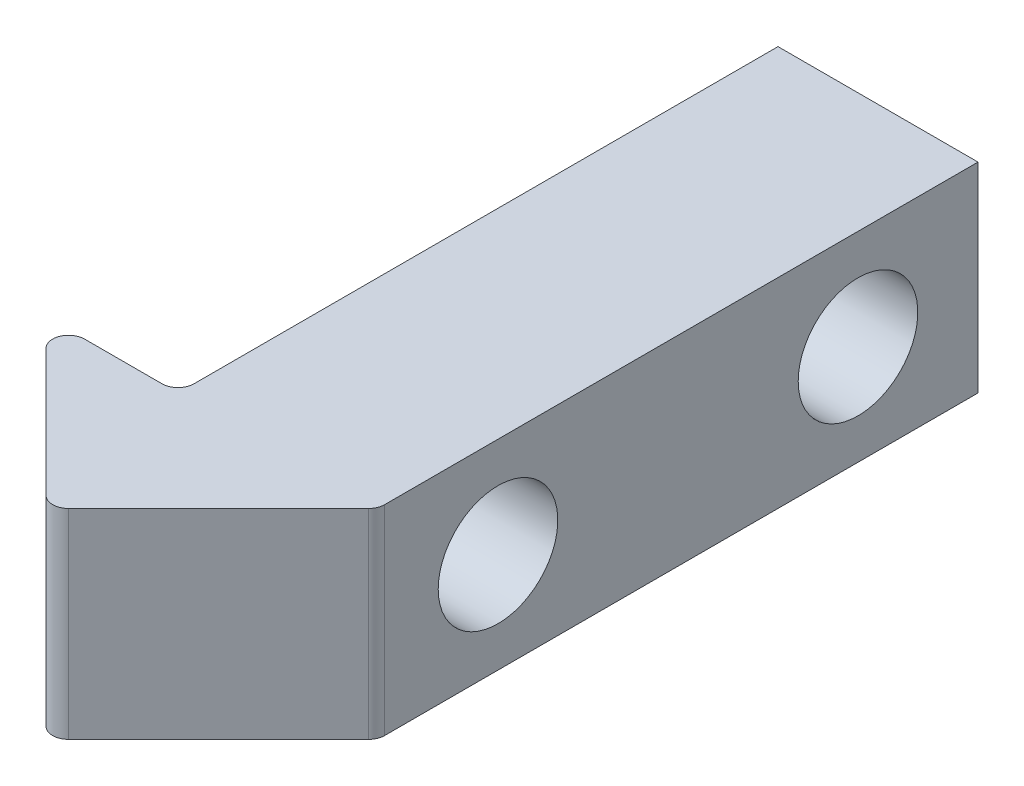
ISO-10303-21;
HEADER;
FILE_DESCRIPTION(('STEP AP214'),'2;1');
FILE_NAME('part.step','',(''),(''),'','','');
FILE_SCHEMA(('AUTOMOTIVE_DESIGN { 1 0 10303 214 1 1 1 1 }'));
ENDSEC;
DATA;
#1=APPLICATION_CONTEXT('core data for automotive mechanical design processes');
#2=APPLICATION_PROTOCOL_DEFINITION('international standard','automotive_design',2000,#1);
#3=PRODUCT_CONTEXT('',#1,'mechanical');
#4=PRODUCT('Part','Part','',(#3));
#5=PRODUCT_RELATED_PRODUCT_CATEGORY('part','',(#4));
#6=PRODUCT_DEFINITION_FORMATION('','',#4);
#7=PRODUCT_DEFINITION_CONTEXT('part definition',#1,'design');
#8=PRODUCT_DEFINITION('design','',#6,#7);
#9=PRODUCT_DEFINITION_SHAPE('','',#8);
#10=(LENGTH_UNIT() NAMED_UNIT(*) SI_UNIT(.MILLI.,.METRE.));
#11=(NAMED_UNIT(*) PLANE_ANGLE_UNIT() SI_UNIT($,.RADIAN.));
#12=(NAMED_UNIT(*) SI_UNIT($,.STERADIAN.) SOLID_ANGLE_UNIT());
#13=UNCERTAINTY_MEASURE_WITH_UNIT(LENGTH_MEASURE(1.E-05),#10,'distance_accuracy_value','');
#14=(GEOMETRIC_REPRESENTATION_CONTEXT(3) GLOBAL_UNCERTAINTY_ASSIGNED_CONTEXT((#13)) GLOBAL_UNIT_ASSIGNED_CONTEXT((#10,
#11,#12)) REPRESENTATION_CONTEXT('',''));
#15=CARTESIAN_POINT('',(0.,0.,0.));
#16=DIRECTION('',(0.,0.,1.));
#17=DIRECTION('',(1.,0.,0.));
#18=AXIS2_PLACEMENT_3D('',#15,#16,#17);
#19=CARTESIAN_POINT('',(-0.0264861876684974,6.35,0.0264861876684974));
#20=DIRECTION('',(-0.707106781186548,0.,0.707106781186548));
#21=DIRECTION('',(0.707106781186548,0.,0.707106781186548));
#22=AXIS2_PLACEMENT_3D('',#19,#20,#21);
#23=PLANE('',#22);
#24=DIRECTION('',(-0.707106781186548,0.,-0.707106781186548));
#25=VECTOR('',#24,1.);
#26=CARTESIAN_POINT('',(-0.0264861876684974,6.35,0.0264861876684974));
#27=LINE('',#26,#25);
#28=CARTESIAN_POINT('',(11.2086350259838,6.35,11.2616074013208));
#29=VERTEX_POINT('',#28);
#30=CARTESIAN_POINT('',(7.16423786950577,6.35,7.21721024484277));
#31=VERTEX_POINT('',#30);
#32=EDGE_CURVE('E180',#29,#31,#27,.T.);
#33=ORIENTED_EDGE('',*,*,#32,.T.);
#34=DIRECTION('',(0.,-1.,0.));
#35=VECTOR('',#34,1.);
#36=CARTESIAN_POINT('',(7.16423786950577,6.35,7.21721024484277));
#37=LINE('',#36,#35);
#38=CARTESIAN_POINT('',(7.16423786950577,0.,7.21721024484277));
#39=VERTEX_POINT('',#38);
#40=EDGE_CURVE('E220',#31,#39,#37,.T.);
#41=ORIENTED_EDGE('',*,*,#40,.T.);
#42=DIRECTION('',(-0.707106781186548,0.,-0.707106781186548));
#43=VECTOR('',#42,1.);
#44=CARTESIAN_POINT('',(-0.0264861876684974,0.,0.0264861876684974));
#45=LINE('',#44,#43);
#46=CARTESIAN_POINT('',(11.2086350259838,0.,11.2616074013208));
#47=VERTEX_POINT('',#46);
#48=EDGE_CURVE('E158',#47,#39,#45,.T.);
#49=ORIENTED_EDGE('',*,*,#48,.F.);
#50=DIRECTION('',(0.,-1.,0.));
#51=VECTOR('',#50,1.);
#52=CARTESIAN_POINT('',(11.2086350259838,6.35,11.2616074013208));
#53=LINE('',#52,#51);
#54=EDGE_CURVE('E63',#47,#29,#53,.F.);
#55=ORIENTED_EDGE('',*,*,#54,.T.);
#56=EDGE_LOOP('',(#33,#41,#49,#55));
#57=FACE_BOUND('',#56,.T.);
#58=ADVANCED_FACE('F40',(#57),#23,.T.);
#59=CARTESIAN_POINT('',(11.5943314584951,6.35,11.5943314584951));
#60=DIRECTION('',(0.707106781186548,0.,0.707106781186548));
#61=DIRECTION('',(0.707106781186548,0.,-0.707106781186548));
#62=AXIS2_PLACEMENT_3D('',#59,#60,#61);
#63=PLANE('',#62);
#64=DIRECTION('',(-0.707106781186548,0.,0.707106781186548));
#65=VECTOR('',#64,1.);
#66=CARTESIAN_POINT('',(11.5943314584951,0.,11.5943314584951));
#67=LINE('',#66,#65);
#68=CARTESIAN_POINT('',(16.689873161833,0.,6.49878975515723));
#69=VERTEX_POINT('',#68);
#70=CARTESIAN_POINT('',(11.9270555156694,0.,11.2616074013208));
#71=VERTEX_POINT('',#70);
#72=EDGE_CURVE('E162',#69,#71,#67,.T.);
#73=ORIENTED_EDGE('',*,*,#72,.F.);
#74=DIRECTION('',(0.,-1.,0.));
#75=VECTOR('',#74,1.);
#76=CARTESIAN_POINT('',(16.689873161833,6.35,6.49878975515723));
#77=LINE('',#76,#75);
#78=CARTESIAN_POINT('',(16.689873161833,6.35,6.49878975515723));
#79=VERTEX_POINT('',#78);
#80=EDGE_CURVE('E208',#69,#79,#77,.F.);
#81=ORIENTED_EDGE('',*,*,#80,.T.);
#82=DIRECTION('',(-0.707106781186548,0.,0.707106781186548));
#83=VECTOR('',#82,1.);
#84=CARTESIAN_POINT('',(11.5943314584951,6.35,11.5943314584951));
#85=LINE('',#84,#83);
#86=CARTESIAN_POINT('',(11.9270555156694,6.35,11.2616074013208));
#87=VERTEX_POINT('',#86);
#88=EDGE_CURVE('E131',#79,#87,#85,.T.);
#89=ORIENTED_EDGE('',*,*,#88,.T.);
#90=DIRECTION('',(0.,-1.,0.));
#91=VECTOR('',#90,1.);
#92=CARTESIAN_POINT('',(11.9270555156694,6.35,11.2616074013208));
#93=LINE('',#92,#91);
#94=EDGE_CURVE('E204',#87,#71,#93,.T.);
#95=ORIENTED_EDGE('',*,*,#94,.T.);
#96=EDGE_LOOP('',(#73,#81,#89,#95));
#97=FACE_BOUND('',#96,.T.);
#98=ADVANCED_FACE('F247',(#97),#63,.T.);
#99=CARTESIAN_POINT('',(16.8386629169902,6.35,0.));
#100=DIRECTION('',(-1.,0.,0.));
#101=DIRECTION('',(0.,0.,1.));
#102=AXIS2_PLACEMENT_3D('',#99,#100,#101);
#103=PLANE('',#102);
#104=CARTESIAN_POINT('',(16.8386629169902,3.175,-8.89));
#105=DIRECTION('',(-1.,0.,0.));
#106=DIRECTION('',(0.,0.,1.));
#107=AXIS2_PLACEMENT_3D('',#104,#105,#106);
#108=CIRCLE('',#107,1.89865);
#109=CARTESIAN_POINT('',(16.8386629169902,3.175,-6.99135));
#110=VERTEX_POINT('',#109);
#111=EDGE_CURVE('E260',#110,#110,#108,.T.);
#112=ORIENTED_EDGE('',*,*,#111,.T.);
#113=EDGE_LOOP('',(#112));
#114=FACE_BOUND('',#113,.T.);
#115=CARTESIAN_POINT('',(16.8386629169902,3.175,2.54));
#116=DIRECTION('',(-1.,0.,0.));
#117=DIRECTION('',(0.,0.,1.));
#118=AXIS2_PLACEMENT_3D('',#115,#116,#117);
#119=CIRCLE('',#118,1.89865);
#120=CARTESIAN_POINT('',(16.8386629169902,3.175,4.43865));
#121=VERTEX_POINT('',#120);
#122=EDGE_CURVE('E163',#121,#121,#119,.T.);
#123=ORIENTED_EDGE('',*,*,#122,.T.);
#124=EDGE_LOOP('',(#123));
#125=FACE_BOUND('',#124,.T.);
#126=DIRECTION('',(0.,0.,-1.));
#127=VECTOR('',#126,1.);
#128=CARTESIAN_POINT('',(16.8386629169902,6.35,0.));
#129=LINE('',#128,#127);
#130=CARTESIAN_POINT('',(16.8386629169902,6.35,6.13957951031447));
#131=VERTEX_POINT('',#130);
#132=CARTESIAN_POINT('',(16.8386629169902,6.35,-12.7));
#133=VERTEX_POINT('',#132);
#134=EDGE_CURVE('E118',#131,#133,#129,.T.);
#135=ORIENTED_EDGE('',*,*,#134,.F.);
#136=DIRECTION('',(0.,-1.,0.));
#137=VECTOR('',#136,1.);
#138=CARTESIAN_POINT('',(16.8386629169902,0.,6.13957951031447));
#139=LINE('',#138,#137);
#140=CARTESIAN_POINT('',(16.8386629169902,0.,6.13957951031447));
#141=VERTEX_POINT('',#140);
#142=EDGE_CURVE('E192',#131,#141,#139,.T.);
#143=ORIENTED_EDGE('',*,*,#142,.T.);
#144=DIRECTION('',(0.,0.,-1.));
#145=VECTOR('',#144,1.);
#146=CARTESIAN_POINT('',(16.8386629169902,0.,0.));
#147=LINE('',#146,#145);
#148=CARTESIAN_POINT('',(16.8386629169902,0.,-12.7));
#149=VERTEX_POINT('',#148);
#150=EDGE_CURVE('E137',#141,#149,#147,.T.);
#151=ORIENTED_EDGE('',*,*,#150,.T.);
#152=DIRECTION('',(0.,-1.,0.));
#153=VECTOR('',#152,1.);
#154=CARTESIAN_POINT('',(16.8386629169902,6.35,-12.7));
#155=LINE('',#154,#153);
#156=EDGE_CURVE('E134',#133,#149,#155,.T.);
#157=ORIENTED_EDGE('',*,*,#156,.F.);
#158=EDGE_LOOP('',(#135,#143,#151,#157));
#159=FACE_BOUND('',#158,.T.);
#160=ADVANCED_FACE('F135',(#114,#125,#159),#103,.F.);
#161=CARTESIAN_POINT('',(0.,6.35,-12.7));
#162=DIRECTION('',(0.,0.,-1.));
#163=DIRECTION('',(-1.,0.,0.));
#164=AXIS2_PLACEMENT_3D('',#161,#162,#163);
#165=PLANE('',#164);
#166=DIRECTION('',(1.,0.,0.));
#167=VECTOR('',#166,1.);
#168=CARTESIAN_POINT('',(0.,0.,-12.7));
#169=LINE('',#168,#167);
#170=CARTESIAN_POINT('',(10.4886629169902,0.,-12.7));
#171=VERTEX_POINT('',#170);
#172=EDGE_CURVE('E169',#171,#149,#169,.T.);
#173=ORIENTED_EDGE('',*,*,#172,.F.);
#174=DIRECTION('',(0.,-1.,0.));
#175=VECTOR('',#174,1.);
#176=CARTESIAN_POINT('',(10.4886629169902,6.35,-12.7));
#177=LINE('',#176,#175);
#178=CARTESIAN_POINT('',(10.4886629169902,6.35,-12.7));
#179=VERTEX_POINT('',#178);
#180=EDGE_CURVE('E143',#179,#171,#177,.T.);
#181=ORIENTED_EDGE('',*,*,#180,.F.);
#182=DIRECTION('',(1.,0.,0.));
#183=VECTOR('',#182,1.);
#184=CARTESIAN_POINT('',(0.,6.35,-12.7));
#185=LINE('',#184,#183);
#186=EDGE_CURVE('E124',#179,#133,#185,.T.);
#187=ORIENTED_EDGE('',*,*,#186,.T.);
#188=ORIENTED_EDGE('',*,*,#156,.T.);
#189=EDGE_LOOP('',(#173,#181,#187,#188));
#190=FACE_BOUND('',#189,.T.);
#191=ADVANCED_FACE('F145',(#190),#165,.T.);
#192=CARTESIAN_POINT('',(10.4886629169902,6.35,0.));
#193=DIRECTION('',(1.,0.,0.));
#194=DIRECTION('',(0.,0.,-1.));
#195=AXIS2_PLACEMENT_3D('',#192,#193,#194);
#196=PLANE('',#195);
#197=CARTESIAN_POINT('',(10.4886629169902,3.175,-8.89));
#198=DIRECTION('',(-1.,0.,0.));
#199=DIRECTION('',(0.,0.,1.));
#200=AXIS2_PLACEMENT_3D('',#197,#198,#199);
#201=CIRCLE('',#200,1.89865);
#202=CARTESIAN_POINT('',(10.4886629169902,3.175,-6.99135));
#203=VERTEX_POINT('',#202);
#204=EDGE_CURVE('E264',#203,#203,#201,.T.);
#205=ORIENTED_EDGE('',*,*,#204,.F.);
#206=EDGE_LOOP('',(#205));
#207=FACE_BOUND('',#206,.T.);
#208=CARTESIAN_POINT('',(10.4886629169902,3.175,2.54));
#209=DIRECTION('',(-1.,0.,0.));
#210=DIRECTION('',(0.,0.,1.));
#211=AXIS2_PLACEMENT_3D('',#208,#209,#210);
#212=CIRCLE('',#211,1.89865);
#213=CARTESIAN_POINT('',(10.4886629169902,3.175,4.43865));
#214=VERTEX_POINT('',#213);
#215=EDGE_CURVE('E256',#214,#214,#212,.T.);
#216=ORIENTED_EDGE('',*,*,#215,.F.);
#217=EDGE_LOOP('',(#216));
#218=FACE_BOUND('',#217,.T.);
#219=DIRECTION('',(0.,0.,1.));
#220=VECTOR('',#219,1.);
#221=CARTESIAN_POINT('',(10.4886629169902,0.,0.));
#222=LINE('',#221,#220);
#223=CARTESIAN_POINT('',(10.4886629169902,0.,5.842));
#224=VERTEX_POINT('',#223);
#225=EDGE_CURVE('E172',#171,#224,#222,.T.);
#226=ORIENTED_EDGE('',*,*,#225,.T.);
#227=DIRECTION('',(0.,-1.,0.));
#228=VECTOR('',#227,1.);
#229=CARTESIAN_POINT('',(10.4886629169902,6.35,5.842));
#230=LINE('',#229,#228);
#231=CARTESIAN_POINT('',(10.4886629169902,6.35,5.842));
#232=VERTEX_POINT('',#231);
#233=EDGE_CURVE('E189',#224,#232,#230,.F.);
#234=ORIENTED_EDGE('',*,*,#233,.T.);
#235=DIRECTION('',(0.,0.,1.));
#236=VECTOR('',#235,1.);
#237=CARTESIAN_POINT('',(10.4886629169902,6.35,0.));
#238=LINE('',#237,#236);
#239=EDGE_CURVE('E148',#179,#232,#238,.T.);
#240=ORIENTED_EDGE('',*,*,#239,.F.);
#241=ORIENTED_EDGE('',*,*,#180,.T.);
#242=EDGE_LOOP('',(#226,#234,#240,#241));
#243=FACE_BOUND('',#242,.T.);
#244=ADVANCED_FACE('F232',(#207,#218,#243),#196,.F.);
#245=CARTESIAN_POINT('',(0.,6.35,6.35));
#246=DIRECTION('',(0.,0.,-1.));
#247=DIRECTION('',(-1.,0.,0.));
#248=AXIS2_PLACEMENT_3D('',#245,#246,#247);
#249=PLANE('',#248);
#250=DIRECTION('',(1.,0.,0.));
#251=VECTOR('',#250,1.);
#252=CARTESIAN_POINT('',(0.,6.35,6.35));
#253=LINE('',#252,#251);
#254=CARTESIAN_POINT('',(7.52344811434854,6.35,6.35));
#255=VERTEX_POINT('',#254);
#256=CARTESIAN_POINT('',(9.98066291699021,6.35,6.35));
#257=VERTEX_POINT('',#256);
#258=EDGE_CURVE('E151',#255,#257,#253,.T.);
#259=ORIENTED_EDGE('',*,*,#258,.T.);
#260=DIRECTION('',(0.,-1.,0.));
#261=VECTOR('',#260,1.);
#262=CARTESIAN_POINT('',(9.98066291699021,6.35,6.35));
#263=LINE('',#262,#261);
#264=CARTESIAN_POINT('',(9.98066291699021,0.,6.35));
#265=VERTEX_POINT('',#264);
#266=EDGE_CURVE('E185',#257,#265,#263,.T.);
#267=ORIENTED_EDGE('',*,*,#266,.T.);
#268=DIRECTION('',(1.,0.,0.));
#269=VECTOR('',#268,1.);
#270=CARTESIAN_POINT('',(0.,0.,6.35));
#271=LINE('',#270,#269);
#272=CARTESIAN_POINT('',(7.52344811434854,0.,6.35));
#273=VERTEX_POINT('',#272);
#274=EDGE_CURVE('E176',#273,#265,#271,.T.);
#275=ORIENTED_EDGE('',*,*,#274,.F.);
#276=DIRECTION('',(0.,-1.,0.));
#277=VECTOR('',#276,1.);
#278=CARTESIAN_POINT('',(7.52344811434854,6.35,6.35));
#279=LINE('',#278,#277);
#280=EDGE_CURVE('E142',#273,#255,#279,.F.);
#281=ORIENTED_EDGE('',*,*,#280,.T.);
#282=EDGE_LOOP('',(#259,#267,#275,#281));
#283=FACE_BOUND('',#282,.T.);
#284=ADVANCED_FACE('F236',(#283),#249,.T.);
#285=CARTESIAN_POINT('',(0.,6.35,0.));
#286=DIRECTION('',(0.,1.,0.));
#287=DIRECTION('',(0.,0.,1.));
#288=AXIS2_PLACEMENT_3D('',#285,#286,#287);
#289=PLANE('',#288);
#290=ORIENTED_EDGE('',*,*,#88,.F.);
#291=CARTESIAN_POINT('',(16.3306629169902,6.35,6.13957951031447));
#292=DIRECTION('',(0.,1.,0.));
#293=DIRECTION('',(0.,0.,1.));
#294=AXIS2_PLACEMENT_3D('',#291,#292,#293);
#295=CIRCLE('',#294,0.508);
#296=EDGE_CURVE('E126',#79,#131,#295,.T.);
#297=ORIENTED_EDGE('',*,*,#296,.T.);
#298=ORIENTED_EDGE('',*,*,#134,.T.);
#299=ORIENTED_EDGE('',*,*,#186,.F.);
#300=ORIENTED_EDGE('',*,*,#239,.T.);
#301=CARTESIAN_POINT('',(9.98066291699021,6.35,5.842));
#302=DIRECTION('',(0.,1.,0.));
#303=DIRECTION('',(0.,0.,1.));
#304=AXIS2_PLACEMENT_3D('',#301,#302,#303);
#305=CIRCLE('',#304,0.508);
#306=EDGE_CURVE('E11',#232,#257,#305,.F.);
#307=ORIENTED_EDGE('',*,*,#306,.T.);
#308=ORIENTED_EDGE('',*,*,#258,.F.);
#309=CARTESIAN_POINT('',(7.52344811434854,6.35,6.858));
#310=DIRECTION('',(0.,1.,0.));
#311=DIRECTION('',(0.,0.,1.));
#312=AXIS2_PLACEMENT_3D('',#309,#310,#311);
#313=CIRCLE('',#312,0.508);
#314=EDGE_CURVE('E56',#255,#31,#313,.T.);
#315=ORIENTED_EDGE('',*,*,#314,.T.);
#316=ORIENTED_EDGE('',*,*,#32,.F.);
#317=CARTESIAN_POINT('',(11.5678452708266,6.35,10.9023971564781));
#318=DIRECTION('',(0.,1.,0.));
#319=DIRECTION('',(0.,0.,1.));
#320=AXIS2_PLACEMENT_3D('',#317,#318,#319);
#321=CIRCLE('',#320,0.508);
#322=EDGE_CURVE('E211',#29,#87,#321,.T.);
#323=ORIENTED_EDGE('',*,*,#322,.T.);
#324=EDGE_LOOP('',(#290,#297,#298,#299,#300,#307,#308,#315,#316,#323));
#325=FACE_BOUND('',#324,.T.);
#326=ADVANCED_FACE('F121',(#325),#289,.T.);
#327=CARTESIAN_POINT('',(0.,0.,0.));
#328=DIRECTION('',(0.,1.,0.));
#329=DIRECTION('',(0.,0.,1.));
#330=AXIS2_PLACEMENT_3D('',#327,#328,#329);
#331=PLANE('',#330);
#332=ORIENTED_EDGE('',*,*,#150,.F.);
#333=CARTESIAN_POINT('',(16.3306629169902,0.,6.13957951031447));
#334=DIRECTION('',(0.,1.,0.));
#335=DIRECTION('',(0.,0.,1.));
#336=AXIS2_PLACEMENT_3D('',#333,#334,#335);
#337=CIRCLE('',#336,0.508);
#338=EDGE_CURVE('E201',#141,#69,#337,.F.);
#339=ORIENTED_EDGE('',*,*,#338,.T.);
#340=ORIENTED_EDGE('',*,*,#72,.T.);
#341=CARTESIAN_POINT('',(11.5678452708266,0.,10.9023971564781));
#342=DIRECTION('',(0.,1.,0.));
#343=DIRECTION('',(0.,0.,1.));
#344=AXIS2_PLACEMENT_3D('',#341,#342,#343);
#345=CIRCLE('',#344,0.508);
#346=EDGE_CURVE('E195',#71,#47,#345,.F.);
#347=ORIENTED_EDGE('',*,*,#346,.T.);
#348=ORIENTED_EDGE('',*,*,#48,.T.);
#349=CARTESIAN_POINT('',(7.52344811434854,0.,6.858));
#350=DIRECTION('',(0.,1.,0.));
#351=DIRECTION('',(0.,0.,1.));
#352=AXIS2_PLACEMENT_3D('',#349,#350,#351);
#353=CIRCLE('',#352,0.508);
#354=EDGE_CURVE('E198',#39,#273,#353,.F.);
#355=ORIENTED_EDGE('',*,*,#354,.T.);
#356=ORIENTED_EDGE('',*,*,#274,.T.);
#357=CARTESIAN_POINT('',(9.98066291699021,0.,5.842));
#358=DIRECTION('',(0.,1.,0.));
#359=DIRECTION('',(0.,0.,1.));
#360=AXIS2_PLACEMENT_3D('',#357,#358,#359);
#361=CIRCLE('',#360,0.508);
#362=EDGE_CURVE('E49',#265,#224,#361,.T.);
#363=ORIENTED_EDGE('',*,*,#362,.T.);
#364=ORIENTED_EDGE('',*,*,#225,.F.);
#365=ORIENTED_EDGE('',*,*,#172,.T.);
#366=EDGE_LOOP('',(#332,#339,#340,#347,#348,#355,#356,#363,#364,#365));
#367=FACE_BOUND('',#366,.T.);
#368=ADVANCED_FACE('F226',(#367),#331,.F.);
#369=CARTESIAN_POINT('',(10.4886629169902,3.175,2.54));
#370=DIRECTION('',(-1.,0.,0.));
#371=DIRECTION('',(0.,0.,1.));
#372=AXIS2_PLACEMENT_3D('',#369,#370,#371);
#373=CYLINDRICAL_SURFACE('',#372,1.89865);
#374=ORIENTED_EDGE('',*,*,#215,.T.);
#375=EDGE_LOOP('',(#374));
#376=FACE_BOUND('',#375,.T.);
#377=ORIENTED_EDGE('',*,*,#122,.F.);
#378=EDGE_LOOP('',(#377));
#379=FACE_BOUND('',#378,.T.);
#380=ADVANCED_FACE('F277',(#376,#379),#373,.F.);
#381=CARTESIAN_POINT('',(10.4886629169902,3.175,-8.89));
#382=DIRECTION('',(-1.,0.,0.));
#383=DIRECTION('',(0.,0.,1.));
#384=AXIS2_PLACEMENT_3D('',#381,#382,#383);
#385=CYLINDRICAL_SURFACE('',#384,1.89865);
#386=ORIENTED_EDGE('',*,*,#204,.T.);
#387=EDGE_LOOP('',(#386));
#388=FACE_BOUND('',#387,.T.);
#389=ORIENTED_EDGE('',*,*,#111,.F.);
#390=EDGE_LOOP('',(#389));
#391=FACE_BOUND('',#390,.T.);
#392=ADVANCED_FACE('F269',(#388,#391),#385,.F.);
#393=CARTESIAN_POINT('',(9.98066291699021,6.35,5.842));
#394=DIRECTION('',(0.,-1.,0.));
#395=DIRECTION('',(0.,0.,-1.));
#396=AXIS2_PLACEMENT_3D('',#393,#394,#395);
#397=CYLINDRICAL_SURFACE('',#396,0.508);
#398=ORIENTED_EDGE('',*,*,#306,.F.);
#399=ORIENTED_EDGE('',*,*,#233,.F.);
#400=ORIENTED_EDGE('',*,*,#362,.F.);
#401=ORIENTED_EDGE('',*,*,#266,.F.);
#402=EDGE_LOOP('',(#398,#399,#400,#401));
#403=FACE_BOUND('',#402,.T.);
#404=ADVANCED_FACE('F234',(#403),#397,.F.);
#405=CARTESIAN_POINT('',(16.3306629169902,6.35,6.13957951031447));
#406=DIRECTION('',(0.,1.,0.));
#407=DIRECTION('',(0.,0.,1.));
#408=AXIS2_PLACEMENT_3D('',#405,#406,#407);
#409=CYLINDRICAL_SURFACE('',#408,0.508);
#410=ORIENTED_EDGE('',*,*,#296,.F.);
#411=ORIENTED_EDGE('',*,*,#80,.F.);
#412=ORIENTED_EDGE('',*,*,#338,.F.);
#413=ORIENTED_EDGE('',*,*,#142,.F.);
#414=EDGE_LOOP('',(#410,#411,#412,#413));
#415=FACE_BOUND('',#414,.T.);
#416=ADVANCED_FACE('F300',(#415),#409,.T.);
#417=CARTESIAN_POINT('',(7.52344811434854,6.35,6.858));
#418=DIRECTION('',(0.,-1.,0.));
#419=DIRECTION('',(0.,0.,-1.));
#420=AXIS2_PLACEMENT_3D('',#417,#418,#419);
#421=CYLINDRICAL_SURFACE('',#420,0.508);
#422=ORIENTED_EDGE('',*,*,#314,.F.);
#423=ORIENTED_EDGE('',*,*,#280,.F.);
#424=ORIENTED_EDGE('',*,*,#354,.F.);
#425=ORIENTED_EDGE('',*,*,#40,.F.);
#426=EDGE_LOOP('',(#422,#423,#424,#425));
#427=FACE_BOUND('',#426,.T.);
#428=ADVANCED_FACE('F239',(#427),#421,.T.);
#429=CARTESIAN_POINT('',(11.5678452708266,6.35,10.9023971564781));
#430=DIRECTION('',(0.,-1.,0.));
#431=DIRECTION('',(0.,0.,-1.));
#432=AXIS2_PLACEMENT_3D('',#429,#430,#431);
#433=CYLINDRICAL_SURFACE('',#432,0.508);
#434=ORIENTED_EDGE('',*,*,#322,.F.);
#435=ORIENTED_EDGE('',*,*,#54,.F.);
#436=ORIENTED_EDGE('',*,*,#346,.F.);
#437=ORIENTED_EDGE('',*,*,#94,.F.);
#438=EDGE_LOOP('',(#434,#435,#436,#437));
#439=FACE_BOUND('',#438,.T.);
#440=ADVANCED_FACE('F42',(#439),#433,.T.);
#441=CLOSED_SHELL('',(#58,#98,#160,#191,#244,#284,#326,#368,#380,#392,#404,#416,#428,#440));
#442=MANIFOLD_SOLID_BREP('B2',#441);
#443=ADVANCED_BREP_SHAPE_REPRESENTATION('',(#18,#442),#14);
#444=SHAPE_DEFINITION_REPRESENTATION(#9,#443);
ENDSEC;
END-ISO-10303-21;
